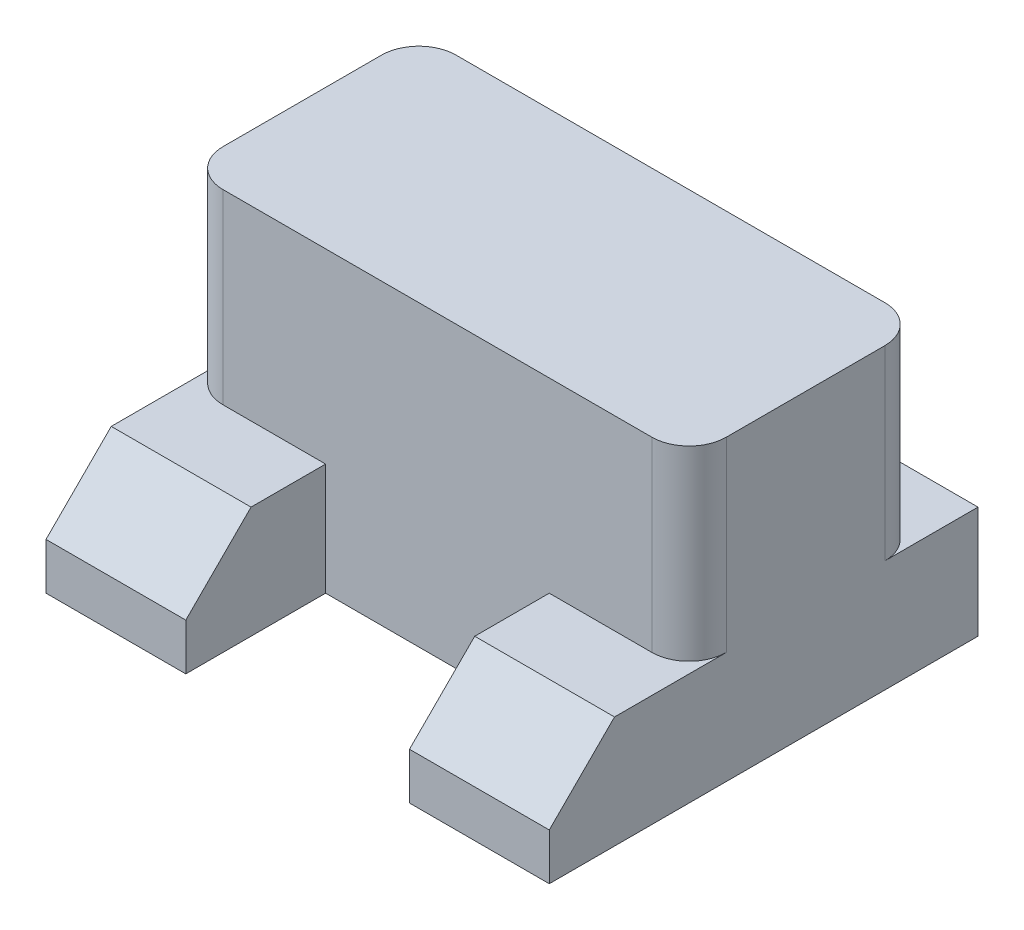
ISO-10303-21;
HEADER;
FILE_DESCRIPTION(('STEP AP214'),'2;1');
FILE_NAME('part.step','',(''),(''),'','','');
FILE_SCHEMA(('AUTOMOTIVE_DESIGN { 1 0 10303 214 1 1 1 1 }'));
ENDSEC;
DATA;
#1=APPLICATION_CONTEXT('core data for automotive mechanical design processes');
#2=APPLICATION_PROTOCOL_DEFINITION('international standard','automotive_design',2000,#1);
#3=PRODUCT_CONTEXT('',#1,'mechanical');
#4=PRODUCT('Part','Part','',(#3));
#5=PRODUCT_RELATED_PRODUCT_CATEGORY('part','',(#4));
#6=PRODUCT_DEFINITION_FORMATION('','',#4);
#7=PRODUCT_DEFINITION_CONTEXT('part definition',#1,'design');
#8=PRODUCT_DEFINITION('design','',#6,#7);
#9=PRODUCT_DEFINITION_SHAPE('','',#8);
#10=(LENGTH_UNIT() NAMED_UNIT(*) SI_UNIT(.MILLI.,.METRE.));
#11=(NAMED_UNIT(*) PLANE_ANGLE_UNIT() SI_UNIT($,.RADIAN.));
#12=(NAMED_UNIT(*) SI_UNIT($,.STERADIAN.) SOLID_ANGLE_UNIT());
#13=UNCERTAINTY_MEASURE_WITH_UNIT(LENGTH_MEASURE(1.E-05),#10,'distance_accuracy_value','');
#14=(GEOMETRIC_REPRESENTATION_CONTEXT(3) GLOBAL_UNCERTAINTY_ASSIGNED_CONTEXT((#13)) GLOBAL_UNIT_ASSIGNED_CONTEXT((#10,
#11,#12)) REPRESENTATION_CONTEXT('',''));
#15=CARTESIAN_POINT('',(0.,0.,0.));
#16=DIRECTION('',(0.,0.,1.));
#17=DIRECTION('',(1.,0.,0.));
#18=AXIS2_PLACEMENT_3D('',#15,#16,#17);
#19=CARTESIAN_POINT('',(-2.3,-1.2,1.25));
#20=DIRECTION('',(0.,0.,1.));
#21=DIRECTION('',(1.,0.,0.));
#22=AXIS2_PLACEMENT_3D('',#19,#20,#21);
#23=PLANE('',#22);
#24=DIRECTION('',(-1.,0.,0.));
#25=VECTOR('',#24,1.);
#26=CARTESIAN_POINT('',(-1.2,0.,1.25));
#27=LINE('',#26,#25);
#28=CARTESIAN_POINT('',(-1.2,0.,1.25));
#29=VERTEX_POINT('',#28);
#30=CARTESIAN_POINT('',(-2.3,0.,1.25));
#31=VERTEX_POINT('',#30);
#32=EDGE_CURVE('E214',#29,#31,#27,.T.);
#33=ORIENTED_EDGE('',*,*,#32,.F.);
#34=DIRECTION('',(0.,1.,0.));
#35=VECTOR('',#34,1.);
#36=CARTESIAN_POINT('',(-1.2,-1.2,1.25));
#37=LINE('',#36,#35);
#38=CARTESIAN_POINT('',(-1.2,-1.2,1.25));
#39=VERTEX_POINT('',#38);
#40=EDGE_CURVE('E236',#39,#29,#37,.T.);
#41=ORIENTED_EDGE('',*,*,#40,.F.);
#42=DIRECTION('',(1.,0.,0.));
#43=VECTOR('',#42,1.);
#44=CARTESIAN_POINT('',(-2.3,-1.2,1.25));
#45=LINE('',#44,#43);
#46=CARTESIAN_POINT('',(1.2,-1.2,1.25));
#47=VERTEX_POINT('',#46);
#48=EDGE_CURVE('E225',#39,#47,#45,.T.);
#49=ORIENTED_EDGE('',*,*,#48,.T.);
#50=DIRECTION('',(0.,-1.,0.));
#51=VECTOR('',#50,1.);
#52=CARTESIAN_POINT('',(1.2,0.,1.25));
#53=LINE('',#52,#51);
#54=CARTESIAN_POINT('',(1.2,0.,1.25));
#55=VERTEX_POINT('',#54);
#56=EDGE_CURVE('E247',#55,#47,#53,.T.);
#57=ORIENTED_EDGE('',*,*,#56,.F.);
#58=DIRECTION('',(-1.,0.,0.));
#59=VECTOR('',#58,1.);
#60=CARTESIAN_POINT('',(2.7,0.,1.25));
#61=LINE('',#60,#59);
#62=CARTESIAN_POINT('',(2.3,0.,1.25));
#63=VERTEX_POINT('',#62);
#64=EDGE_CURVE('E242',#63,#55,#61,.T.);
#65=ORIENTED_EDGE('',*,*,#64,.F.);
#66=DIRECTION('',(0.,1.,0.));
#67=VECTOR('',#66,1.);
#68=CARTESIAN_POINT('',(2.3,-1.2,1.25));
#69=LINE('',#68,#67);
#70=CARTESIAN_POINT('',(2.3,2.,1.25));
#71=VERTEX_POINT('',#70);
#72=EDGE_CURVE('E383',#63,#71,#69,.T.);
#73=ORIENTED_EDGE('',*,*,#72,.T.);
#74=DIRECTION('',(1.,0.,0.));
#75=VECTOR('',#74,1.);
#76=CARTESIAN_POINT('',(-2.3,2.,1.25));
#77=LINE('',#76,#75);
#78=CARTESIAN_POINT('',(-2.3,2.,1.25));
#79=VERTEX_POINT('',#78);
#80=EDGE_CURVE('E358',#79,#71,#77,.T.);
#81=ORIENTED_EDGE('',*,*,#80,.F.);
#82=DIRECTION('',(0.,1.,0.));
#83=VECTOR('',#82,1.);
#84=CARTESIAN_POINT('',(-2.3,-1.2,1.25));
#85=LINE('',#84,#83);
#86=EDGE_CURVE('E381',#31,#79,#85,.T.);
#87=ORIENTED_EDGE('',*,*,#86,.F.);
#88=EDGE_LOOP('',(#33,#41,#49,#57,#65,#73,#81,#87));
#89=FACE_BOUND('',#88,.T.);
#90=ADVANCED_FACE('F33',(#89),#23,.T.);
#91=CARTESIAN_POINT('',(-2.3,-1.2,-1.25));
#92=DIRECTION('',(0.,0.,1.));
#93=DIRECTION('',(1.,0.,0.));
#94=AXIS2_PLACEMENT_3D('',#91,#92,#93);
#95=PLANE('',#94);
#96=DIRECTION('',(0.,1.,0.));
#97=VECTOR('',#96,1.);
#98=CARTESIAN_POINT('',(1.2,0.,-1.25));
#99=LINE('',#98,#97);
#100=CARTESIAN_POINT('',(1.2,-1.2,-1.25));
#101=VERTEX_POINT('',#100);
#102=CARTESIAN_POINT('',(1.2,0.,-1.25));
#103=VERTEX_POINT('',#102);
#104=EDGE_CURVE('E261',#101,#103,#99,.T.);
#105=ORIENTED_EDGE('',*,*,#104,.F.);
#106=DIRECTION('',(1.,0.,0.));
#107=VECTOR('',#106,1.);
#108=CARTESIAN_POINT('',(-2.3,-1.2,-1.25));
#109=LINE('',#108,#107);
#110=CARTESIAN_POINT('',(-1.2,-1.2,-1.25));
#111=VERTEX_POINT('',#110);
#112=EDGE_CURVE('E370',#111,#101,#109,.T.);
#113=ORIENTED_EDGE('',*,*,#112,.F.);
#114=DIRECTION('',(0.,-1.,0.));
#115=VECTOR('',#114,1.);
#116=CARTESIAN_POINT('',(-1.2,0.,-1.25));
#117=LINE('',#116,#115);
#118=CARTESIAN_POINT('',(-1.2,0.,-1.25));
#119=VERTEX_POINT('',#118);
#120=EDGE_CURVE('E283',#119,#111,#117,.T.);
#121=ORIENTED_EDGE('',*,*,#120,.F.);
#122=DIRECTION('',(1.,0.,0.));
#123=VECTOR('',#122,1.);
#124=CARTESIAN_POINT('',(-2.7,0.,-1.25));
#125=LINE('',#124,#123);
#126=CARTESIAN_POINT('',(-2.3,0.,-1.25));
#127=VERTEX_POINT('',#126);
#128=EDGE_CURVE('E280',#127,#119,#125,.T.);
#129=ORIENTED_EDGE('',*,*,#128,.F.);
#130=DIRECTION('',(0.,1.,0.));
#131=VECTOR('',#130,1.);
#132=CARTESIAN_POINT('',(-2.3,-1.2,-1.25));
#133=LINE('',#132,#131);
#134=CARTESIAN_POINT('',(-2.3,2.,-1.25));
#135=VERTEX_POINT('',#134);
#136=EDGE_CURVE('E224',#127,#135,#133,.T.);
#137=ORIENTED_EDGE('',*,*,#136,.T.);
#138=DIRECTION('',(1.,0.,0.));
#139=VECTOR('',#138,1.);
#140=CARTESIAN_POINT('',(-2.3,2.,-1.25));
#141=LINE('',#140,#139);
#142=CARTESIAN_POINT('',(2.3,2.,-1.25));
#143=VERTEX_POINT('',#142);
#144=EDGE_CURVE('E346',#135,#143,#141,.T.);
#145=ORIENTED_EDGE('',*,*,#144,.T.);
#146=DIRECTION('',(0.,1.,0.));
#147=VECTOR('',#146,1.);
#148=CARTESIAN_POINT('',(2.3,-1.2,-1.25));
#149=LINE('',#148,#147);
#150=CARTESIAN_POINT('',(2.3,0.,-1.25));
#151=VERTEX_POINT('',#150);
#152=EDGE_CURVE('E389',#151,#143,#149,.T.);
#153=ORIENTED_EDGE('',*,*,#152,.F.);
#154=DIRECTION('',(1.,0.,0.));
#155=VECTOR('',#154,1.);
#156=CARTESIAN_POINT('',(2.7,0.,-1.25));
#157=LINE('',#156,#155);
#158=EDGE_CURVE('E266',#103,#151,#157,.T.);
#159=ORIENTED_EDGE('',*,*,#158,.F.);
#160=EDGE_LOOP('',(#105,#113,#121,#129,#137,#145,#153,#159));
#161=FACE_BOUND('',#160,.T.);
#162=ADVANCED_FACE('F426',(#161),#95,.F.);
#163=CARTESIAN_POINT('',(2.3,-1.2,-0.85));
#164=DIRECTION('',(0.,1.,0.));
#165=DIRECTION('',(0.,0.,1.));
#166=AXIS2_PLACEMENT_3D('',#163,#164,#165);
#167=CYLINDRICAL_SURFACE('',#166,0.4);
#168=DIRECTION('',(0.,1.,0.));
#169=VECTOR('',#168,1.);
#170=CARTESIAN_POINT('',(2.7,-1.2,-0.849999999999996));
#171=LINE('',#170,#169);
#172=CARTESIAN_POINT('',(2.7,0.,-0.849999999999996));
#173=VERTEX_POINT('',#172);
#174=CARTESIAN_POINT('',(2.7,2.,-0.849999999999996));
#175=VERTEX_POINT('',#174);
#176=EDGE_CURVE('E387',#173,#175,#171,.T.);
#177=ORIENTED_EDGE('',*,*,#176,.F.);
#178=CARTESIAN_POINT('',(2.3,0.,-0.85));
#179=DIRECTION('',(0.,1.,0.));
#180=DIRECTION('',(0.,0.,1.));
#181=AXIS2_PLACEMENT_3D('',#178,#179,#180);
#182=CIRCLE('',#181,0.4);
#183=EDGE_CURVE('E343',#173,#151,#182,.T.);
#184=ORIENTED_EDGE('',*,*,#183,.T.);
#185=ORIENTED_EDGE('',*,*,#152,.T.);
#186=CARTESIAN_POINT('',(2.3,2.,-0.85));
#187=DIRECTION('',(0.,-1.,0.));
#188=DIRECTION('',(0.,0.,-1.));
#189=AXIS2_PLACEMENT_3D('',#186,#187,#188);
#190=CIRCLE('',#189,0.4);
#191=EDGE_CURVE('E349',#143,#175,#190,.T.);
#192=ORIENTED_EDGE('',*,*,#191,.T.);
#193=EDGE_LOOP('',(#177,#184,#185,#192));
#194=FACE_BOUND('',#193,.T.);
#195=ADVANCED_FACE('F432',(#194),#167,.T.);
#196=CARTESIAN_POINT('',(2.7,-1.2,-0.849999999999996));
#197=DIRECTION('',(-1.,0.,0.));
#198=DIRECTION('',(0.,0.,1.));
#199=AXIS2_PLACEMENT_3D('',#196,#197,#198);
#200=PLANE('',#199);
#201=DIRECTION('',(0.,0.,-1.));
#202=VECTOR('',#201,1.);
#203=CARTESIAN_POINT('',(2.7,0.,-1.25));
#204=LINE('',#203,#202);
#205=CARTESIAN_POINT('',(2.7,0.,2.05));
#206=VERTEX_POINT('',#205);
#207=CARTESIAN_POINT('',(2.7,0.,0.849999999999998));
#208=VERTEX_POINT('',#207);
#209=EDGE_CURVE('E331',#206,#208,#204,.T.);
#210=ORIENTED_EDGE('',*,*,#209,.F.);
#211=DIRECTION('',(0.,0.707106781186546,-0.707106781186549));
#212=VECTOR('',#211,1.);
#213=CARTESIAN_POINT('',(2.7,-0.699999999999999,2.75));
#214=LINE('',#213,#212);
#215=CARTESIAN_POINT('',(2.7,-0.699999999999999,2.75));
#216=VERTEX_POINT('',#215);
#217=EDGE_CURVE('E11',#206,#216,#214,.F.);
#218=ORIENTED_EDGE('',*,*,#217,.T.);
#219=DIRECTION('',(0.,1.,0.));
#220=VECTOR('',#219,1.);
#221=CARTESIAN_POINT('',(2.7,-1.2,2.75));
#222=LINE('',#221,#220);
#223=CARTESIAN_POINT('',(2.7,-1.2,2.75));
#224=VERTEX_POINT('',#223);
#225=EDGE_CURVE('E243',#224,#216,#222,.T.);
#226=ORIENTED_EDGE('',*,*,#225,.F.);
#227=DIRECTION('',(0.,0.,1.));
#228=VECTOR('',#227,1.);
#229=CARTESIAN_POINT('',(2.7,-1.2,-0.849999999999996));
#230=LINE('',#229,#228);
#231=CARTESIAN_POINT('',(2.7,-1.2,-1.85));
#232=VERTEX_POINT('',#231);
#233=EDGE_CURVE('E373',#232,#224,#230,.T.);
#234=ORIENTED_EDGE('',*,*,#233,.F.);
#235=DIRECTION('',(0.,-1.,0.));
#236=VECTOR('',#235,1.);
#237=CARTESIAN_POINT('',(2.7,0.,-1.85));
#238=LINE('',#237,#236);
#239=CARTESIAN_POINT('',(2.7,0.,-1.85));
#240=VERTEX_POINT('',#239);
#241=EDGE_CURVE('E262',#240,#232,#238,.T.);
#242=ORIENTED_EDGE('',*,*,#241,.F.);
#243=EDGE_CURVE('E330',#173,#240,#204,.T.);
#244=ORIENTED_EDGE('',*,*,#243,.F.);
#245=ORIENTED_EDGE('',*,*,#176,.T.);
#246=DIRECTION('',(0.,0.,1.));
#247=VECTOR('',#246,1.);
#248=CARTESIAN_POINT('',(2.7,2.,-0.849999999999996));
#249=LINE('',#248,#247);
#250=CARTESIAN_POINT('',(2.7,2.,0.849999999999998));
#251=VERTEX_POINT('',#250);
#252=EDGE_CURVE('E352',#175,#251,#249,.T.);
#253=ORIENTED_EDGE('',*,*,#252,.T.);
#254=DIRECTION('',(0.,1.,0.));
#255=VECTOR('',#254,1.);
#256=CARTESIAN_POINT('',(2.7,-1.2,0.849999999999998));
#257=LINE('',#256,#255);
#258=EDGE_CURVE('E385',#208,#251,#257,.T.);
#259=ORIENTED_EDGE('',*,*,#258,.F.);
#260=EDGE_LOOP('',(#210,#218,#226,#234,#242,#244,#245,#253,#259));
#261=FACE_BOUND('',#260,.T.);
#262=ADVANCED_FACE('F416',(#261),#200,.F.);
#263=CARTESIAN_POINT('',(2.3,-1.2,0.850000000000001));
#264=DIRECTION('',(0.,1.,0.));
#265=DIRECTION('',(0.,0.,1.));
#266=AXIS2_PLACEMENT_3D('',#263,#264,#265);
#267=CYLINDRICAL_SURFACE('',#266,0.4);
#268=CARTESIAN_POINT('',(2.3,0.,0.850000000000001));
#269=DIRECTION('',(0.,1.,0.));
#270=DIRECTION('',(0.,0.,1.));
#271=AXIS2_PLACEMENT_3D('',#268,#269,#270);
#272=CIRCLE('',#271,0.4);
#273=EDGE_CURVE('E340',#208,#63,#272,.F.);
#274=ORIENTED_EDGE('',*,*,#273,.F.);
#275=ORIENTED_EDGE('',*,*,#258,.T.);
#276=CARTESIAN_POINT('',(2.3,2.,0.850000000000001));
#277=DIRECTION('',(0.,1.,0.));
#278=DIRECTION('',(0.,0.,1.));
#279=AXIS2_PLACEMENT_3D('',#276,#277,#278);
#280=CIRCLE('',#279,0.4);
#281=EDGE_CURVE('E355',#71,#251,#280,.T.);
#282=ORIENTED_EDGE('',*,*,#281,.F.);
#283=ORIENTED_EDGE('',*,*,#72,.F.);
#284=EDGE_LOOP('',(#274,#275,#282,#283));
#285=FACE_BOUND('',#284,.T.);
#286=ADVANCED_FACE('F440',(#285),#267,.T.);
#287=CARTESIAN_POINT('',(-2.3,-1.2,0.850000000000001));
#288=DIRECTION('',(0.,1.,0.));
#289=DIRECTION('',(0.,0.,1.));
#290=AXIS2_PLACEMENT_3D('',#287,#288,#289);
#291=CYLINDRICAL_SURFACE('',#290,0.4);
#292=CARTESIAN_POINT('',(-2.3,0.,0.850000000000001));
#293=DIRECTION('',(0.,1.,0.));
#294=DIRECTION('',(0.,0.,1.));
#295=AXIS2_PLACEMENT_3D('',#292,#293,#294);
#296=CIRCLE('',#295,0.4);
#297=CARTESIAN_POINT('',(-2.7,0.,0.849999999999997));
#298=VERTEX_POINT('',#297);
#299=EDGE_CURVE('E337',#31,#298,#296,.F.);
#300=ORIENTED_EDGE('',*,*,#299,.F.);
#301=ORIENTED_EDGE('',*,*,#86,.T.);
#302=CARTESIAN_POINT('',(-2.3,2.,0.850000000000001));
#303=DIRECTION('',(0.,1.,0.));
#304=DIRECTION('',(0.,0.,1.));
#305=AXIS2_PLACEMENT_3D('',#302,#303,#304);
#306=CIRCLE('',#305,0.4);
#307=CARTESIAN_POINT('',(-2.7,2.,0.849999999999997));
#308=VERTEX_POINT('',#307);
#309=EDGE_CURVE('E361',#308,#79,#306,.T.);
#310=ORIENTED_EDGE('',*,*,#309,.F.);
#311=DIRECTION('',(0.,1.,0.));
#312=VECTOR('',#311,1.);
#313=CARTESIAN_POINT('',(-2.7,-1.2,0.849999999999997));
#314=LINE('',#313,#312);
#315=EDGE_CURVE('E379',#298,#308,#314,.T.);
#316=ORIENTED_EDGE('',*,*,#315,.F.);
#317=EDGE_LOOP('',(#300,#301,#310,#316));
#318=FACE_BOUND('',#317,.T.);
#319=ADVANCED_FACE('F438',(#318),#291,.T.);
#320=CARTESIAN_POINT('',(-2.7,-1.2,-0.849999999999997));
#321=DIRECTION('',(-1.,0.,0.));
#322=DIRECTION('',(0.,0.,1.));
#323=AXIS2_PLACEMENT_3D('',#320,#321,#322);
#324=PLANE('',#323);
#325=DIRECTION('',(0.,-1.,0.));
#326=VECTOR('',#325,1.);
#327=CARTESIAN_POINT('',(-2.7,0.,2.75));
#328=LINE('',#327,#326);
#329=CARTESIAN_POINT('',(-2.7,-0.699999999999999,2.75));
#330=VERTEX_POINT('',#329);
#331=CARTESIAN_POINT('',(-2.7,-1.2,2.75));
#332=VERTEX_POINT('',#331);
#333=EDGE_CURVE('E204',#330,#332,#328,.T.);
#334=ORIENTED_EDGE('',*,*,#333,.F.);
#335=DIRECTION('',(0.,-0.707106781186546,0.707106781186549));
#336=VECTOR('',#335,1.);
#337=CARTESIAN_POINT('',(-2.7,0.850000000000001,1.19999999999999));
#338=LINE('',#337,#336);
#339=CARTESIAN_POINT('',(-2.7,0.,2.05));
#340=VERTEX_POINT('',#339);
#341=EDGE_CURVE('E395',#330,#340,#338,.F.);
#342=ORIENTED_EDGE('',*,*,#341,.T.);
#343=DIRECTION('',(0.,0.,1.));
#344=VECTOR('',#343,1.);
#345=CARTESIAN_POINT('',(-2.7,0.,-1.25));
#346=LINE('',#345,#344);
#347=EDGE_CURVE('E333',#298,#340,#346,.T.);
#348=ORIENTED_EDGE('',*,*,#347,.F.);
#349=ORIENTED_EDGE('',*,*,#315,.T.);
#350=DIRECTION('',(0.,0.,1.));
#351=VECTOR('',#350,1.);
#352=CARTESIAN_POINT('',(-2.7,2.,-0.849999999999997));
#353=LINE('',#352,#351);
#354=CARTESIAN_POINT('',(-2.7,2.,-0.849999999999997));
#355=VERTEX_POINT('',#354);
#356=EDGE_CURVE('E364',#355,#308,#353,.T.);
#357=ORIENTED_EDGE('',*,*,#356,.F.);
#358=DIRECTION('',(0.,1.,0.));
#359=VECTOR('',#358,1.);
#360=CARTESIAN_POINT('',(-2.7,-1.2,-0.849999999999997));
#361=LINE('',#360,#359);
#362=CARTESIAN_POINT('',(-2.7,0.,-0.849999999999997));
#363=VERTEX_POINT('',#362);
#364=EDGE_CURVE('E377',#363,#355,#361,.T.);
#365=ORIENTED_EDGE('',*,*,#364,.F.);
#366=CARTESIAN_POINT('',(-2.7,0.,-1.85));
#367=VERTEX_POINT('',#366);
#368=EDGE_CURVE('E334',#367,#363,#346,.T.);
#369=ORIENTED_EDGE('',*,*,#368,.F.);
#370=DIRECTION('',(0.,1.,0.));
#371=VECTOR('',#370,1.);
#372=CARTESIAN_POINT('',(-2.7,0.,-1.85));
#373=LINE('',#372,#371);
#374=CARTESIAN_POINT('',(-2.7,-1.2,-1.85));
#375=VERTEX_POINT('',#374);
#376=EDGE_CURVE('E220',#375,#367,#373,.T.);
#377=ORIENTED_EDGE('',*,*,#376,.F.);
#378=DIRECTION('',(0.,0.,1.));
#379=VECTOR('',#378,1.);
#380=CARTESIAN_POINT('',(-2.7,-1.2,-0.849999999999997));
#381=LINE('',#380,#379);
#382=EDGE_CURVE('E217',#375,#332,#381,.T.);
#383=ORIENTED_EDGE('',*,*,#382,.T.);
#384=EDGE_LOOP('',(#334,#342,#348,#349,#357,#365,#369,#377,#383));
#385=FACE_BOUND('',#384,.T.);
#386=ADVANCED_FACE('F218',(#385),#324,.T.);
#387=CARTESIAN_POINT('',(-2.3,-1.2,-0.85));
#388=DIRECTION('',(0.,1.,0.));
#389=DIRECTION('',(0.,0.,1.));
#390=AXIS2_PLACEMENT_3D('',#387,#388,#389);
#391=CYLINDRICAL_SURFACE('',#390,0.4);
#392=CARTESIAN_POINT('',(-2.3,0.,-0.85));
#393=DIRECTION('',(0.,1.,0.));
#394=DIRECTION('',(0.,0.,1.));
#395=AXIS2_PLACEMENT_3D('',#392,#393,#394);
#396=CIRCLE('',#395,0.4);
#397=EDGE_CURVE('E391',#363,#127,#396,.F.);
#398=ORIENTED_EDGE('',*,*,#397,.F.);
#399=ORIENTED_EDGE('',*,*,#364,.T.);
#400=CARTESIAN_POINT('',(-2.3,2.,-0.85));
#401=DIRECTION('',(0.,1.,0.));
#402=DIRECTION('',(0.,0.,1.));
#403=AXIS2_PLACEMENT_3D('',#400,#401,#402);
#404=CIRCLE('',#403,0.4);
#405=EDGE_CURVE('E367',#135,#355,#404,.T.);
#406=ORIENTED_EDGE('',*,*,#405,.F.);
#407=ORIENTED_EDGE('',*,*,#136,.F.);
#408=EDGE_LOOP('',(#398,#399,#406,#407));
#409=FACE_BOUND('',#408,.T.);
#410=ADVANCED_FACE('F482',(#409),#391,.T.);
#411=CARTESIAN_POINT('',(2.3,-1.2,-0.85));
#412=DIRECTION('',(0.,-1.,0.));
#413=DIRECTION('',(0.,0.,-1.));
#414=AXIS2_PLACEMENT_3D('',#411,#412,#413);
#415=PLANE('',#414);
#416=DIRECTION('',(0.,0.,-1.));
#417=VECTOR('',#416,1.);
#418=CARTESIAN_POINT('',(-2.,-1.2,-0.9));
#419=LINE('',#418,#417);
#420=CARTESIAN_POINT('',(-2.,-1.2,0.6));
#421=VERTEX_POINT('',#420);
#422=CARTESIAN_POINT('',(-2.,-1.2,-0.9));
#423=VERTEX_POINT('',#422);
#424=EDGE_CURVE('E297',#421,#423,#419,.T.);
#425=ORIENTED_EDGE('',*,*,#424,.F.);
#426=DIRECTION('',(-1.,0.,0.));
#427=VECTOR('',#426,1.);
#428=CARTESIAN_POINT('',(-2.,-1.2,0.6));
#429=LINE('',#428,#427);
#430=CARTESIAN_POINT('',(2.,-1.2,0.6));
#431=VERTEX_POINT('',#430);
#432=EDGE_CURVE('E302',#431,#421,#429,.T.);
#433=ORIENTED_EDGE('',*,*,#432,.F.);
#434=DIRECTION('',(0.,0.,1.));
#435=VECTOR('',#434,1.);
#436=CARTESIAN_POINT('',(2.,-1.2,-0.9));
#437=LINE('',#436,#435);
#438=CARTESIAN_POINT('',(2.,-1.2,-0.9));
#439=VERTEX_POINT('',#438);
#440=EDGE_CURVE('E314',#439,#431,#437,.T.);
#441=ORIENTED_EDGE('',*,*,#440,.F.);
#442=DIRECTION('',(1.,0.,0.));
#443=VECTOR('',#442,1.);
#444=CARTESIAN_POINT('',(-2.,-1.2,-0.9));
#445=LINE('',#444,#443);
#446=EDGE_CURVE('E311',#423,#439,#445,.T.);
#447=ORIENTED_EDGE('',*,*,#446,.F.);
#448=EDGE_LOOP('',(#425,#433,#441,#447));
#449=FACE_BOUND('',#448,.T.);
#450=ORIENTED_EDGE('',*,*,#382,.F.);
#451=DIRECTION('',(-1.,0.,0.));
#452=VECTOR('',#451,1.);
#453=CARTESIAN_POINT('',(-2.7,-1.2,-1.85));
#454=LINE('',#453,#452);
#455=CARTESIAN_POINT('',(-1.2,-1.2,-1.85));
#456=VERTEX_POINT('',#455);
#457=EDGE_CURVE('E287',#456,#375,#454,.T.);
#458=ORIENTED_EDGE('',*,*,#457,.F.);
#459=DIRECTION('',(0.,0.,1.));
#460=VECTOR('',#459,1.);
#461=CARTESIAN_POINT('',(-1.2,-1.2,-1.85));
#462=LINE('',#461,#460);
#463=EDGE_CURVE('E289',#456,#111,#462,.T.);
#464=ORIENTED_EDGE('',*,*,#463,.T.);
#465=ORIENTED_EDGE('',*,*,#112,.T.);
#466=DIRECTION('',(0.,0.,1.));
#467=VECTOR('',#466,1.);
#468=CARTESIAN_POINT('',(1.2,-1.2,-1.85));
#469=LINE('',#468,#467);
#470=CARTESIAN_POINT('',(1.2,-1.2,-1.85));
#471=VERTEX_POINT('',#470);
#472=EDGE_CURVE('E278',#471,#101,#469,.T.);
#473=ORIENTED_EDGE('',*,*,#472,.F.);
#474=DIRECTION('',(-1.,0.,0.));
#475=VECTOR('',#474,1.);
#476=CARTESIAN_POINT('',(2.7,-1.2,-1.85));
#477=LINE('',#476,#475);
#478=EDGE_CURVE('E265',#232,#471,#477,.T.);
#479=ORIENTED_EDGE('',*,*,#478,.F.);
#480=ORIENTED_EDGE('',*,*,#233,.T.);
#481=DIRECTION('',(1.,0.,0.));
#482=VECTOR('',#481,1.);
#483=CARTESIAN_POINT('',(1.2,-1.2,2.75));
#484=LINE('',#483,#482);
#485=CARTESIAN_POINT('',(1.2,-1.2,2.75));
#486=VERTEX_POINT('',#485);
#487=EDGE_CURVE('E249',#486,#224,#484,.T.);
#488=ORIENTED_EDGE('',*,*,#487,.F.);
#489=DIRECTION('',(0.,0.,-1.));
#490=VECTOR('',#489,1.);
#491=CARTESIAN_POINT('',(1.2,-1.2,2.75));
#492=LINE('',#491,#490);
#493=EDGE_CURVE('E252',#486,#47,#492,.T.);
#494=ORIENTED_EDGE('',*,*,#493,.T.);
#495=ORIENTED_EDGE('',*,*,#48,.F.);
#496=DIRECTION('',(0.,0.,-1.));
#497=VECTOR('',#496,1.);
#498=CARTESIAN_POINT('',(-1.2,-1.2,2.75));
#499=LINE('',#498,#497);
#500=CARTESIAN_POINT('',(-1.2,-1.2,2.75));
#501=VERTEX_POINT('',#500);
#502=EDGE_CURVE('E229',#501,#39,#499,.T.);
#503=ORIENTED_EDGE('',*,*,#502,.F.);
#504=DIRECTION('',(1.,0.,0.));
#505=VECTOR('',#504,1.);
#506=CARTESIAN_POINT('',(-2.7,-1.2,2.75));
#507=LINE('',#506,#505);
#508=EDGE_CURVE('E209',#332,#501,#507,.T.);
#509=ORIENTED_EDGE('',*,*,#508,.F.);
#510=EDGE_LOOP('',(#450,#458,#464,#465,#473,#479,#480,#488,#494,#495,#503,#509));
#511=FACE_BOUND('',#510,.T.);
#512=ADVANCED_FACE('F227',(#449,#511),#415,.T.);
#513=CARTESIAN_POINT('',(2.3,2.,-0.85));
#514=DIRECTION('',(0.,-1.,0.));
#515=DIRECTION('',(0.,0.,-1.));
#516=AXIS2_PLACEMENT_3D('',#513,#514,#515);
#517=PLANE('',#516);
#518=ORIENTED_EDGE('',*,*,#144,.F.);
#519=ORIENTED_EDGE('',*,*,#405,.T.);
#520=ORIENTED_EDGE('',*,*,#356,.T.);
#521=ORIENTED_EDGE('',*,*,#309,.T.);
#522=ORIENTED_EDGE('',*,*,#80,.T.);
#523=ORIENTED_EDGE('',*,*,#281,.T.);
#524=ORIENTED_EDGE('',*,*,#252,.F.);
#525=ORIENTED_EDGE('',*,*,#191,.F.);
#526=EDGE_LOOP('',(#518,#519,#520,#521,#522,#523,#524,#525));
#527=FACE_BOUND('',#526,.T.);
#528=ADVANCED_FACE('F457',(#527),#517,.F.);
#529=CARTESIAN_POINT('',(0.,0.,0.));
#530=DIRECTION('',(0.,1.,0.));
#531=DIRECTION('',(0.,0.,1.));
#532=AXIS2_PLACEMENT_3D('',#529,#530,#531);
#533=PLANE('',#532);
#534=ORIENTED_EDGE('',*,*,#368,.T.);
#535=ORIENTED_EDGE('',*,*,#397,.T.);
#536=ORIENTED_EDGE('',*,*,#128,.T.);
#537=DIRECTION('',(0.,0.,1.));
#538=VECTOR('',#537,1.);
#539=CARTESIAN_POINT('',(-1.2,0.,-1.85));
#540=LINE('',#539,#538);
#541=CARTESIAN_POINT('',(-1.2,0.,-1.85));
#542=VERTEX_POINT('',#541);
#543=EDGE_CURVE('E294',#542,#119,#540,.T.);
#544=ORIENTED_EDGE('',*,*,#543,.F.);
#545=DIRECTION('',(1.,0.,0.));
#546=VECTOR('',#545,1.);
#547=CARTESIAN_POINT('',(-2.7,0.,-1.85));
#548=LINE('',#547,#546);
#549=EDGE_CURVE('E282',#367,#542,#548,.T.);
#550=ORIENTED_EDGE('',*,*,#549,.F.);
#551=EDGE_LOOP('',(#534,#535,#536,#544,#550));
#552=FACE_BOUND('',#551,.T.);
#553=ADVANCED_FACE('F485',(#552),#533,.T.);
#554=ORIENTED_EDGE('',*,*,#347,.T.);
#555=DIRECTION('',(1.,0.,0.));
#556=VECTOR('',#555,1.);
#557=CARTESIAN_POINT('',(0.,0.,2.05));
#558=LINE('',#557,#556);
#559=CARTESIAN_POINT('',(-1.2,0.,2.05));
#560=VERTEX_POINT('',#559);
#561=EDGE_CURVE('E397',#340,#560,#558,.T.);
#562=ORIENTED_EDGE('',*,*,#561,.T.);
#563=DIRECTION('',(0.,0.,-1.));
#564=VECTOR('',#563,1.);
#565=CARTESIAN_POINT('',(-1.2,0.,2.75));
#566=LINE('',#565,#564);
#567=EDGE_CURVE('E233',#560,#29,#566,.T.);
#568=ORIENTED_EDGE('',*,*,#567,.T.);
#569=ORIENTED_EDGE('',*,*,#32,.T.);
#570=ORIENTED_EDGE('',*,*,#299,.T.);
#571=EDGE_LOOP('',(#554,#562,#568,#569,#570));
#572=FACE_BOUND('',#571,.T.);
#573=ADVANCED_FACE('F473',(#572),#533,.T.);
#574=DIRECTION('',(0.,0.,-1.));
#575=VECTOR('',#574,1.);
#576=CARTESIAN_POINT('',(1.2,0.,2.75));
#577=LINE('',#576,#575);
#578=CARTESIAN_POINT('',(1.2,0.,2.05));
#579=VERTEX_POINT('',#578);
#580=EDGE_CURVE('E259',#579,#55,#577,.T.);
#581=ORIENTED_EDGE('',*,*,#580,.F.);
#582=DIRECTION('',(1.,0.,0.));
#583=VECTOR('',#582,1.);
#584=CARTESIAN_POINT('',(0.,0.,2.05));
#585=LINE('',#584,#583);
#586=EDGE_CURVE('E41',#579,#206,#585,.T.);
#587=ORIENTED_EDGE('',*,*,#586,.T.);
#588=ORIENTED_EDGE('',*,*,#209,.T.);
#589=ORIENTED_EDGE('',*,*,#273,.T.);
#590=ORIENTED_EDGE('',*,*,#64,.T.);
#591=EDGE_LOOP('',(#581,#587,#588,#589,#590));
#592=FACE_BOUND('',#591,.T.);
#593=ADVANCED_FACE('F462',(#592),#533,.T.);
#594=ORIENTED_EDGE('',*,*,#183,.F.);
#595=ORIENTED_EDGE('',*,*,#243,.T.);
#596=DIRECTION('',(1.,0.,0.));
#597=VECTOR('',#596,1.);
#598=CARTESIAN_POINT('',(2.7,0.,-1.85));
#599=LINE('',#598,#597);
#600=CARTESIAN_POINT('',(1.2,0.,-1.85));
#601=VERTEX_POINT('',#600);
#602=EDGE_CURVE('E270',#601,#240,#599,.T.);
#603=ORIENTED_EDGE('',*,*,#602,.F.);
#604=DIRECTION('',(0.,0.,1.));
#605=VECTOR('',#604,1.);
#606=CARTESIAN_POINT('',(1.2,0.,-1.85));
#607=LINE('',#606,#605);
#608=EDGE_CURVE('E273',#601,#103,#607,.T.);
#609=ORIENTED_EDGE('',*,*,#608,.T.);
#610=ORIENTED_EDGE('',*,*,#158,.T.);
#611=EDGE_LOOP('',(#594,#595,#603,#609,#610));
#612=FACE_BOUND('',#611,.T.);
#613=ADVANCED_FACE('F503',(#612),#533,.T.);
#614=CARTESIAN_POINT('',(-2.,-1.7,-0.9));
#615=DIRECTION('',(1.,0.,0.));
#616=DIRECTION('',(0.,0.,-1.));
#617=AXIS2_PLACEMENT_3D('',#614,#615,#616);
#618=PLANE('',#617);
#619=ORIENTED_EDGE('',*,*,#424,.T.);
#620=DIRECTION('',(0.,1.,0.));
#621=VECTOR('',#620,1.);
#622=CARTESIAN_POINT('',(-2.,-1.7,-0.9));
#623=LINE('',#622,#621);
#624=CARTESIAN_POINT('',(-2.,-1.7,-0.9));
#625=VERTEX_POINT('',#624);
#626=EDGE_CURVE('E327',#625,#423,#623,.T.);
#627=ORIENTED_EDGE('',*,*,#626,.F.);
#628=DIRECTION('',(0.,0.,-1.));
#629=VECTOR('',#628,1.);
#630=CARTESIAN_POINT('',(-2.,-1.7,-0.9));
#631=LINE('',#630,#629);
#632=CARTESIAN_POINT('',(-2.,-1.7,0.6));
#633=VERTEX_POINT('',#632);
#634=EDGE_CURVE('E298',#633,#625,#631,.T.);
#635=ORIENTED_EDGE('',*,*,#634,.F.);
#636=DIRECTION('',(0.,1.,0.));
#637=VECTOR('',#636,1.);
#638=CARTESIAN_POINT('',(-2.,-1.7,0.6));
#639=LINE('',#638,#637);
#640=EDGE_CURVE('E308',#633,#421,#639,.T.);
#641=ORIENTED_EDGE('',*,*,#640,.T.);
#642=EDGE_LOOP('',(#619,#627,#635,#641));
#643=FACE_BOUND('',#642,.T.);
#644=ADVANCED_FACE('F536',(#643),#618,.F.);
#645=CARTESIAN_POINT('',(-2.,-1.7,-0.9));
#646=DIRECTION('',(0.,0.,1.));
#647=DIRECTION('',(1.,0.,0.));
#648=AXIS2_PLACEMENT_3D('',#645,#646,#647);
#649=PLANE('',#648);
#650=ORIENTED_EDGE('',*,*,#446,.T.);
#651=DIRECTION('',(0.,1.,0.));
#652=VECTOR('',#651,1.);
#653=CARTESIAN_POINT('',(2.,-1.7,-0.9));
#654=LINE('',#653,#652);
#655=CARTESIAN_POINT('',(2.,-1.7,-0.9));
#656=VERTEX_POINT('',#655);
#657=EDGE_CURVE('E324',#656,#439,#654,.T.);
#658=ORIENTED_EDGE('',*,*,#657,.F.);
#659=DIRECTION('',(1.,0.,0.));
#660=VECTOR('',#659,1.);
#661=CARTESIAN_POINT('',(-2.,-1.7,-0.9));
#662=LINE('',#661,#660);
#663=EDGE_CURVE('E301',#625,#656,#662,.T.);
#664=ORIENTED_EDGE('',*,*,#663,.F.);
#665=ORIENTED_EDGE('',*,*,#626,.T.);
#666=EDGE_LOOP('',(#650,#658,#664,#665));
#667=FACE_BOUND('',#666,.T.);
#668=ADVANCED_FACE('F532',(#667),#649,.F.);
#669=CARTESIAN_POINT('',(2.,-1.7,-0.9));
#670=DIRECTION('',(-1.,0.,0.));
#671=DIRECTION('',(0.,0.,1.));
#672=AXIS2_PLACEMENT_3D('',#669,#670,#671);
#673=PLANE('',#672);
#674=ORIENTED_EDGE('',*,*,#440,.T.);
#675=DIRECTION('',(0.,1.,0.));
#676=VECTOR('',#675,1.);
#677=CARTESIAN_POINT('',(2.,-1.7,0.6));
#678=LINE('',#677,#676);
#679=CARTESIAN_POINT('',(2.,-1.7,0.6));
#680=VERTEX_POINT('',#679);
#681=EDGE_CURVE('E321',#680,#431,#678,.T.);
#682=ORIENTED_EDGE('',*,*,#681,.F.);
#683=DIRECTION('',(0.,0.,1.));
#684=VECTOR('',#683,1.);
#685=CARTESIAN_POINT('',(2.,-1.7,-0.9));
#686=LINE('',#685,#684);
#687=EDGE_CURVE('E304',#656,#680,#686,.T.);
#688=ORIENTED_EDGE('',*,*,#687,.F.);
#689=ORIENTED_EDGE('',*,*,#657,.T.);
#690=EDGE_LOOP('',(#674,#682,#688,#689));
#691=FACE_BOUND('',#690,.T.);
#692=ADVANCED_FACE('F528',(#691),#673,.F.);
#693=CARTESIAN_POINT('',(-2.,-1.7,0.6));
#694=DIRECTION('',(0.,0.,-1.));
#695=DIRECTION('',(-1.,0.,0.));
#696=AXIS2_PLACEMENT_3D('',#693,#694,#695);
#697=PLANE('',#696);
#698=ORIENTED_EDGE('',*,*,#432,.T.);
#699=ORIENTED_EDGE('',*,*,#640,.F.);
#700=DIRECTION('',(-1.,0.,0.));
#701=VECTOR('',#700,1.);
#702=CARTESIAN_POINT('',(-2.,-1.7,0.6));
#703=LINE('',#702,#701);
#704=EDGE_CURVE('E306',#680,#633,#703,.T.);
#705=ORIENTED_EDGE('',*,*,#704,.F.);
#706=ORIENTED_EDGE('',*,*,#681,.T.);
#707=EDGE_LOOP('',(#698,#699,#705,#706));
#708=FACE_BOUND('',#707,.T.);
#709=ADVANCED_FACE('F524',(#708),#697,.F.);
#710=CARTESIAN_POINT('',(0.,-1.7,0.));
#711=DIRECTION('',(0.,1.,0.));
#712=DIRECTION('',(0.,0.,1.));
#713=AXIS2_PLACEMENT_3D('',#710,#711,#712);
#714=PLANE('',#713);
#715=ORIENTED_EDGE('',*,*,#634,.T.);
#716=ORIENTED_EDGE('',*,*,#663,.T.);
#717=ORIENTED_EDGE('',*,*,#687,.T.);
#718=ORIENTED_EDGE('',*,*,#704,.T.);
#719=EDGE_LOOP('',(#715,#716,#717,#718));
#720=FACE_BOUND('',#719,.T.);
#721=ADVANCED_FACE('F521',(#720),#714,.F.);
#722=CARTESIAN_POINT('',(-1.2,0.,-1.85));
#723=DIRECTION('',(-1.,0.,0.));
#724=DIRECTION('',(0.,-1.,0.));
#725=AXIS2_PLACEMENT_3D('',#722,#723,#724);
#726=PLANE('',#725);
#727=ORIENTED_EDGE('',*,*,#120,.T.);
#728=ORIENTED_EDGE('',*,*,#463,.F.);
#729=DIRECTION('',(0.,-1.,0.));
#730=VECTOR('',#729,1.);
#731=CARTESIAN_POINT('',(-1.2,0.,-1.85));
#732=LINE('',#731,#730);
#733=EDGE_CURVE('E285',#542,#456,#732,.T.);
#734=ORIENTED_EDGE('',*,*,#733,.F.);
#735=ORIENTED_EDGE('',*,*,#543,.T.);
#736=EDGE_LOOP('',(#727,#728,#734,#735));
#737=FACE_BOUND('',#736,.T.);
#738=ADVANCED_FACE('F518',(#737),#726,.F.);
#739=CARTESIAN_POINT('',(0.,0.,-1.85));
#740=DIRECTION('',(0.,0.,1.));
#741=DIRECTION('',(1.,0.,0.));
#742=AXIS2_PLACEMENT_3D('',#739,#740,#741);
#743=PLANE('',#742);
#744=ORIENTED_EDGE('',*,*,#376,.T.);
#745=ORIENTED_EDGE('',*,*,#549,.T.);
#746=ORIENTED_EDGE('',*,*,#733,.T.);
#747=ORIENTED_EDGE('',*,*,#457,.T.);
#748=EDGE_LOOP('',(#744,#745,#746,#747));
#749=FACE_BOUND('',#748,.T.);
#750=ADVANCED_FACE('F489',(#749),#743,.F.);
#751=CARTESIAN_POINT('',(1.2,0.,-1.85));
#752=DIRECTION('',(1.,0.,0.));
#753=DIRECTION('',(0.,1.,0.));
#754=AXIS2_PLACEMENT_3D('',#751,#752,#753);
#755=PLANE('',#754);
#756=ORIENTED_EDGE('',*,*,#104,.T.);
#757=ORIENTED_EDGE('',*,*,#608,.F.);
#758=DIRECTION('',(0.,1.,0.));
#759=VECTOR('',#758,1.);
#760=CARTESIAN_POINT('',(1.2,0.,-1.85));
#761=LINE('',#760,#759);
#762=EDGE_CURVE('E268',#471,#601,#761,.T.);
#763=ORIENTED_EDGE('',*,*,#762,.F.);
#764=ORIENTED_EDGE('',*,*,#472,.T.);
#765=EDGE_LOOP('',(#756,#757,#763,#764));
#766=FACE_BOUND('',#765,.T.);
#767=ADVANCED_FACE('F499',(#766),#755,.F.);
#768=CARTESIAN_POINT('',(0.,0.,-1.85));
#769=DIRECTION('',(0.,0.,-1.));
#770=DIRECTION('',(-1.,0.,0.));
#771=AXIS2_PLACEMENT_3D('',#768,#769,#770);
#772=PLANE('',#771);
#773=ORIENTED_EDGE('',*,*,#241,.T.);
#774=ORIENTED_EDGE('',*,*,#478,.T.);
#775=ORIENTED_EDGE('',*,*,#762,.T.);
#776=ORIENTED_EDGE('',*,*,#602,.T.);
#777=EDGE_LOOP('',(#773,#774,#775,#776));
#778=FACE_BOUND('',#777,.T.);
#779=ADVANCED_FACE('F505',(#778),#772,.T.);
#780=CARTESIAN_POINT('',(1.2,0.,2.75));
#781=DIRECTION('',(1.,0.,0.));
#782=DIRECTION('',(0.,1.,0.));
#783=AXIS2_PLACEMENT_3D('',#780,#781,#782);
#784=PLANE('',#783);
#785=DIRECTION('',(0.,-1.,0.));
#786=VECTOR('',#785,1.);
#787=CARTESIAN_POINT('',(1.2,0.,2.75));
#788=LINE('',#787,#786);
#789=CARTESIAN_POINT('',(1.2,-0.699999999999999,2.75));
#790=VERTEX_POINT('',#789);
#791=EDGE_CURVE('E246',#790,#486,#788,.T.);
#792=ORIENTED_EDGE('',*,*,#791,.F.);
#793=DIRECTION('',(0.,-0.707106781186546,0.707106781186549));
#794=VECTOR('',#793,1.);
#795=CARTESIAN_POINT('',(1.2,-0.699999999999999,2.75));
#796=LINE('',#795,#794);
#797=EDGE_CURVE('E55',#790,#579,#796,.F.);
#798=ORIENTED_EDGE('',*,*,#797,.T.);
#799=ORIENTED_EDGE('',*,*,#580,.T.);
#800=ORIENTED_EDGE('',*,*,#56,.T.);
#801=ORIENTED_EDGE('',*,*,#493,.F.);
#802=EDGE_LOOP('',(#792,#798,#799,#800,#801));
#803=FACE_BOUND('',#802,.T.);
#804=ADVANCED_FACE('F411',(#803),#784,.F.);
#805=CARTESIAN_POINT('',(0.,0.,2.75));
#806=DIRECTION('',(0.,0.,1.));
#807=DIRECTION('',(1.,0.,0.));
#808=AXIS2_PLACEMENT_3D('',#805,#806,#807);
#809=PLANE('',#808);
#810=ORIENTED_EDGE('',*,*,#225,.T.);
#811=DIRECTION('',(-1.,0.,0.));
#812=VECTOR('',#811,1.);
#813=CARTESIAN_POINT('',(0.,-0.699999999999999,2.75));
#814=LINE('',#813,#812);
#815=EDGE_CURVE('E401',#216,#790,#814,.T.);
#816=ORIENTED_EDGE('',*,*,#815,.T.);
#817=ORIENTED_EDGE('',*,*,#791,.T.);
#818=ORIENTED_EDGE('',*,*,#487,.T.);
#819=EDGE_LOOP('',(#810,#816,#817,#818));
#820=FACE_BOUND('',#819,.T.);
#821=ADVANCED_FACE('F406',(#820),#809,.T.);
#822=CARTESIAN_POINT('',(-1.2,-1.2,2.75));
#823=DIRECTION('',(-1.,0.,0.));
#824=DIRECTION('',(0.,-1.,0.));
#825=AXIS2_PLACEMENT_3D('',#822,#823,#824);
#826=PLANE('',#825);
#827=ORIENTED_EDGE('',*,*,#567,.F.);
#828=DIRECTION('',(0.,0.707106781186546,-0.707106781186549));
#829=VECTOR('',#828,1.);
#830=CARTESIAN_POINT('',(-1.2,-0.699999999999999,2.75));
#831=LINE('',#830,#829);
#832=CARTESIAN_POINT('',(-1.2,-0.699999999999999,2.75));
#833=VERTEX_POINT('',#832);
#834=EDGE_CURVE('E399',#560,#833,#831,.F.);
#835=ORIENTED_EDGE('',*,*,#834,.T.);
#836=DIRECTION('',(0.,1.,0.));
#837=VECTOR('',#836,1.);
#838=CARTESIAN_POINT('',(-1.2,-1.2,2.75));
#839=LINE('',#838,#837);
#840=EDGE_CURVE('E231',#501,#833,#839,.T.);
#841=ORIENTED_EDGE('',*,*,#840,.F.);
#842=ORIENTED_EDGE('',*,*,#502,.T.);
#843=ORIENTED_EDGE('',*,*,#40,.T.);
#844=EDGE_LOOP('',(#827,#835,#841,#842,#843));
#845=FACE_BOUND('',#844,.T.);
#846=ADVANCED_FACE('F467',(#845),#826,.F.);
#847=CARTESIAN_POINT('',(0.,0.,2.75));
#848=DIRECTION('',(0.,0.,1.));
#849=DIRECTION('',(1.,0.,0.));
#850=AXIS2_PLACEMENT_3D('',#847,#848,#849);
#851=PLANE('',#850);
#852=ORIENTED_EDGE('',*,*,#840,.T.);
#853=DIRECTION('',(-1.,0.,0.));
#854=VECTOR('',#853,1.);
#855=CARTESIAN_POINT('',(0.,-0.699999999999999,2.75));
#856=LINE('',#855,#854);
#857=EDGE_CURVE('E212',#833,#330,#856,.T.);
#858=ORIENTED_EDGE('',*,*,#857,.T.);
#859=ORIENTED_EDGE('',*,*,#333,.T.);
#860=ORIENTED_EDGE('',*,*,#508,.T.);
#861=EDGE_LOOP('',(#852,#858,#859,#860));
#862=FACE_BOUND('',#861,.T.);
#863=ADVANCED_FACE('F207',(#862),#851,.T.);
#864=CARTESIAN_POINT('',(0.,-0.699999999999999,2.75));
#865=DIRECTION('',(0.,-0.707106781186549,-0.707106781186546));
#866=DIRECTION('',(-1.,0.,0.));
#867=AXIS2_PLACEMENT_3D('',#864,#865,#866);
#868=PLANE('',#867);
#869=ORIENTED_EDGE('',*,*,#834,.F.);
#870=ORIENTED_EDGE('',*,*,#561,.F.);
#871=ORIENTED_EDGE('',*,*,#341,.F.);
#872=ORIENTED_EDGE('',*,*,#857,.F.);
#873=EDGE_LOOP('',(#869,#870,#871,#872));
#874=FACE_BOUND('',#873,.T.);
#875=ADVANCED_FACE('F420',(#874),#868,.F.);
#876=CARTESIAN_POINT('',(0.,-0.699999999999999,2.75));
#877=DIRECTION('',(0.,-0.707106781186549,-0.707106781186546));
#878=DIRECTION('',(-1.,0.,0.));
#879=AXIS2_PLACEMENT_3D('',#876,#877,#878);
#880=PLANE('',#879);
#881=ORIENTED_EDGE('',*,*,#217,.F.);
#882=ORIENTED_EDGE('',*,*,#586,.F.);
#883=ORIENTED_EDGE('',*,*,#797,.F.);
#884=ORIENTED_EDGE('',*,*,#815,.F.);
#885=EDGE_LOOP('',(#881,#882,#883,#884));
#886=FACE_BOUND('',#885,.T.);
#887=ADVANCED_FACE('F35',(#886),#880,.F.);
#888=CLOSED_SHELL('',(#90,#162,#195,#262,#286,#319,#386,#410,#512,#528,#553,#573,#593,#613,#644,
#668,#692,#709,#721,#738,#750,#767,#779,#804,#821,#846,#863,#875,#887));
#889=MANIFOLD_SOLID_BREP('B2',#888);
#890=ADVANCED_BREP_SHAPE_REPRESENTATION('',(#18,#889),#14);
#891=SHAPE_DEFINITION_REPRESENTATION(#9,#890);
ENDSEC;
END-ISO-10303-21;
